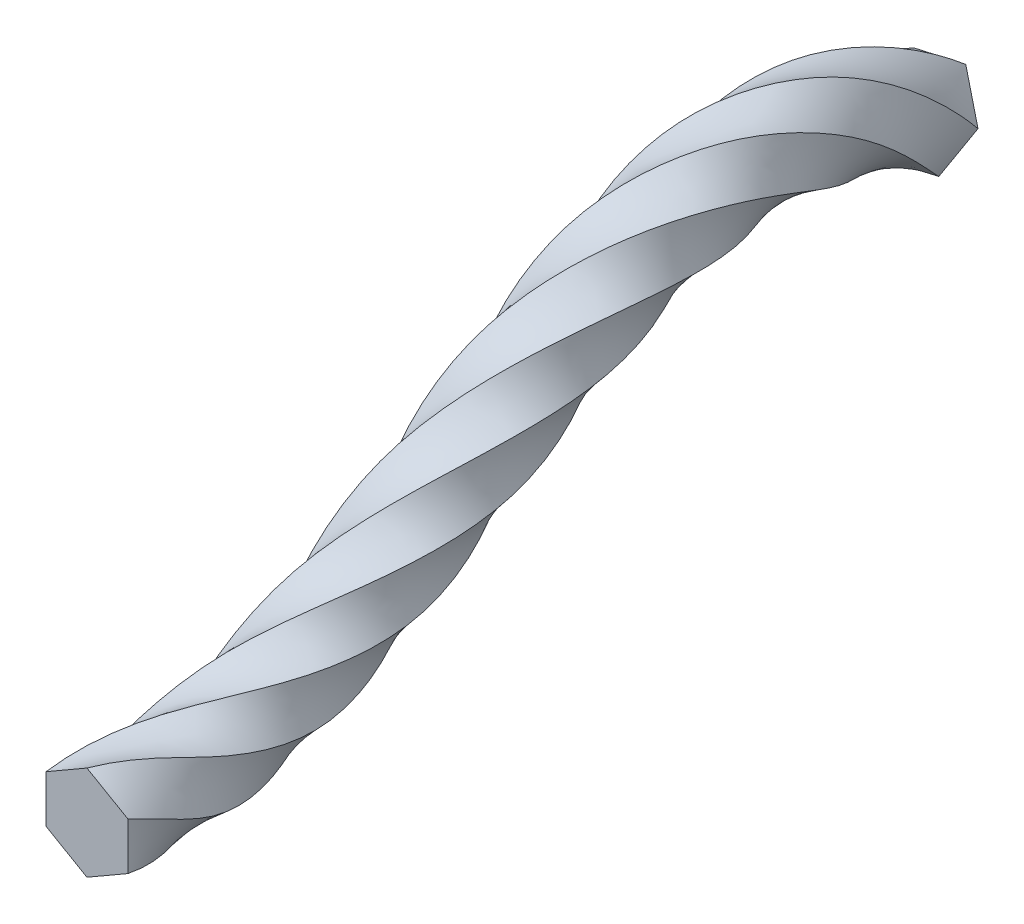
ISO-10303-21;
HEADER;
FILE_DESCRIPTION(('STEP AP214'),'2;1');
FILE_NAME('part.step','',(''),(''),'','','');
FILE_SCHEMA(('AUTOMOTIVE_DESIGN { 1 0 10303 214 1 1 1 1 }'));
ENDSEC;
DATA;
#1=APPLICATION_CONTEXT('core data for automotive mechanical design processes');
#2=APPLICATION_PROTOCOL_DEFINITION('international standard','automotive_design',2000,#1);
#3=PRODUCT_CONTEXT('',#1,'mechanical');
#4=PRODUCT('Part','Part','',(#3));
#5=PRODUCT_RELATED_PRODUCT_CATEGORY('part','',(#4));
#6=PRODUCT_DEFINITION_FORMATION('','',#4);
#7=PRODUCT_DEFINITION_CONTEXT('part definition',#1,'design');
#8=PRODUCT_DEFINITION('design','',#6,#7);
#9=PRODUCT_DEFINITION_SHAPE('','',#8);
#10=(LENGTH_UNIT() NAMED_UNIT(*) SI_UNIT(.MILLI.,.METRE.));
#11=(NAMED_UNIT(*) PLANE_ANGLE_UNIT() SI_UNIT($,.RADIAN.));
#12=(NAMED_UNIT(*) SI_UNIT($,.STERADIAN.) SOLID_ANGLE_UNIT());
#13=UNCERTAINTY_MEASURE_WITH_UNIT(LENGTH_MEASURE(1.E-05),#10,'distance_accuracy_value','');
#14=(GEOMETRIC_REPRESENTATION_CONTEXT(3) GLOBAL_UNCERTAINTY_ASSIGNED_CONTEXT((#13)) GLOBAL_UNIT_ASSIGNED_CONTEXT((#10,
#11,#12)) REPRESENTATION_CONTEXT('',''));
#15=CARTESIAN_POINT('',(0.,0.,0.));
#16=DIRECTION('',(0.,0.,1.));
#17=DIRECTION('',(1.,0.,0.));
#18=AXIS2_PLACEMENT_3D('',#15,#16,#17);
#19=CARTESIAN_POINT('',(0.,0.,0.));
#20=DIRECTION('',(0.,0.,1.));
#21=DIRECTION('',(1.,0.,0.));
#22=AXIS2_PLACEMENT_3D('',#19,#20,#21);
#23=PLANE('',#22);
#24=DIRECTION('',(0.866025403784441,-0.499999999999995,0.));
#25=VECTOR('',#24,1.);
#26=CARTESIAN_POINT('',(-0.866025403784433,-0.50000000000001,0.));
#27=LINE('',#26,#25);
#28=CARTESIAN_POINT('',(-0.866025403784433,-0.50000000000001,0.));
#29=VERTEX_POINT('',#28);
#30=CARTESIAN_POINT('',(0.,-1.,0.));
#31=VERTEX_POINT('',#30);
#32=EDGE_CURVE('E108',#29,#31,#27,.T.);
#33=ORIENTED_EDGE('',*,*,#32,.T.);
#34=DIRECTION('',(0.866025403784438,0.500000000000001,0.));
#35=VECTOR('',#34,1.);
#36=CARTESIAN_POINT('',(0.,-1.,0.));
#37=LINE('',#36,#35);
#38=CARTESIAN_POINT('',(0.86602540378444,-0.499999999999998,0.));
#39=VERTEX_POINT('',#38);
#40=EDGE_CURVE('E116',#31,#39,#37,.T.);
#41=ORIENTED_EDGE('',*,*,#40,.T.);
#42=DIRECTION('',(0.,1.,0.));
#43=VECTOR('',#42,1.);
#44=CARTESIAN_POINT('',(0.86602540378444,-0.499999999999998,0.));
#45=LINE('',#44,#43);
#46=CARTESIAN_POINT('',(0.866025403784436,0.500000000000004,0.));
#47=VERTEX_POINT('',#46);
#48=EDGE_CURVE('E137',#39,#47,#45,.T.);
#49=ORIENTED_EDGE('',*,*,#48,.T.);
#50=DIRECTION('',(-0.866025403784442,0.499999999999995,0.));
#51=VECTOR('',#50,1.);
#52=CARTESIAN_POINT('',(0.866025403784436,0.500000000000004,0.));
#53=LINE('',#52,#51);
#54=CARTESIAN_POINT('',(0.,1.,0.));
#55=VERTEX_POINT('',#54);
#56=EDGE_CURVE('E90',#47,#55,#53,.T.);
#57=ORIENTED_EDGE('',*,*,#56,.T.);
#58=DIRECTION('',(-0.866025403784434,-0.500000000000007,0.));
#59=VECTOR('',#58,1.);
#60=CARTESIAN_POINT('',(0.,1.,0.));
#61=LINE('',#60,#59);
#62=CARTESIAN_POINT('',(-0.866025403784443,0.499999999999992,0.));
#63=VERTEX_POINT('',#62);
#64=EDGE_CURVE('E85',#55,#63,#61,.T.);
#65=ORIENTED_EDGE('',*,*,#64,.T.);
#66=DIRECTION('',(0.,-1.,0.));
#67=VECTOR('',#66,1.);
#68=CARTESIAN_POINT('',(-0.866025403784443,0.499999999999992,0.));
#69=LINE('',#68,#67);
#70=EDGE_CURVE('E79',#63,#29,#69,.T.);
#71=ORIENTED_EDGE('',*,*,#70,.T.);
#72=EDGE_LOOP('',(#33,#41,#49,#57,#65,#71));
#73=FACE_BOUND('',#72,.T.);
#74=ADVANCED_FACE('F43',(#73),#23,.T.);
#75=CARTESIAN_POINT('',(0.,4.13217644037871,-17.754905888552));
#76=DIRECTION('',(0.0158548542778873,0.512418600228263,0.858589425590564));
#77=DIRECTION('',(-0.766044443118991,-0.54563630196883,0.339789548309384));
#78=AXIS2_PLACEMENT_3D('',#75,#76,#77);
#79=PLANE('',#78);
#80=DIRECTION('',(-0.984709970071781,-0.140982412648023,0.102324162176753));
#81=VECTOR('',#80,1.);
#82=CARTESIAN_POINT('',(0.342117926266106,4.9362638251947,-18.241114487928));
#83=LINE('',#82,#81);
#84=CARTESIAN_POINT('',(0.342117926266106,4.9362638251947,-18.241114487928));
#85=VERTEX_POINT('',#84);
#86=CARTESIAN_POINT('',(-0.642592043805665,4.79528141254668,-18.1387903257512));
#87=VERTEX_POINT('',#86);
#88=EDGE_CURVE('E142',#85,#87,#83,.T.);
#89=ORIENTED_EDGE('',*,*,#88,.F.);
#90=DIRECTION('',(-0.642592043805673,0.663104972167966,-0.383884437199228));
#91=VECTOR('',#90,1.);
#92=CARTESIAN_POINT('',(0.98470997007178,4.27315885302673,-17.8572300507288));
#93=LINE('',#92,#91);
#94=CARTESIAN_POINT('',(0.98470997007178,4.27315885302673,-17.8572300507288));
#95=VERTEX_POINT('',#94);
#96=EDGE_CURVE('E11',#95,#85,#93,.T.);
#97=ORIENTED_EDGE('',*,*,#96,.F.);
#98=DIRECTION('',(0.342117926266109,0.804087384815992,-0.486208599375983));
#99=VECTOR('',#98,1.);
#100=CARTESIAN_POINT('',(0.642592043805671,3.46907146821074,-17.3710214513528));
#101=LINE('',#100,#99);
#102=CARTESIAN_POINT('',(0.642592043805671,3.46907146821074,-17.3710214513528));
#103=VERTEX_POINT('',#102);
#104=EDGE_CURVE('E51',#103,#95,#101,.T.);
#105=ORIENTED_EDGE('',*,*,#104,.F.);
#106=DIRECTION('',(0.984709970071781,0.140982412648023,-0.102324162176753));
#107=VECTOR('',#106,1.);
#108=CARTESIAN_POINT('',(-0.342117926266113,3.32808905556272,-17.268697289176));
#109=LINE('',#108,#107);
#110=CARTESIAN_POINT('',(-0.342117926266113,3.32808905556272,-17.268697289176));
#111=VERTEX_POINT('',#110);
#112=EDGE_CURVE('E66',#111,#103,#109,.T.);
#113=ORIENTED_EDGE('',*,*,#112,.F.);
#114=DIRECTION('',(0.642592043805668,-0.66310497216797,0.38388443719923));
#115=VECTOR('',#114,1.);
#116=CARTESIAN_POINT('',(-0.984709970071782,3.99119402773069,-17.6525817263753));
#117=LINE('',#116,#115);
#118=CARTESIAN_POINT('',(-0.984709970071782,3.99119402773069,-17.6525817263753));
#119=VERTEX_POINT('',#118);
#120=EDGE_CURVE('E141',#119,#111,#117,.T.);
#121=ORIENTED_EDGE('',*,*,#120,.F.);
#122=DIRECTION('',(-0.342117926266116,-0.80408738481599,0.486208599375982));
#123=VECTOR('',#122,1.);
#124=CARTESIAN_POINT('',(-0.642592043805665,4.79528141254668,-18.1387903257512));
#125=LINE('',#124,#123);
#126=EDGE_CURVE('E138',#87,#119,#125,.T.);
#127=ORIENTED_EDGE('',*,*,#126,.F.);
#128=EDGE_LOOP('',(#89,#97,#105,#113,#121,#127));
#129=FACE_BOUND('',#128,.T.);
#130=ADVANCED_FACE('F190',(#129),#79,.F.);
#131=CARTESIAN_POINT('',(-0.866025403784433,-0.50000000000001,0.));
#132=CARTESIAN_POINT('',(-0.990954024169116,-0.27035031328757,-0.499358283215992));
#133=CARTESIAN_POINT('',(-1.03057462751443,-0.0438080353986598,-1.09482226872559));
#134=CARTESIAN_POINT('',(-0.899435433540427,0.580297138766811,-2.2700427295419));
#135=CARTESIAN_POINT('',(-0.652307350286108,0.989868677225888,-2.80602449434375));
#136=CARTESIAN_POINT('',(-0.0272287358214304,1.61880723067463,-3.93739442463639));
#137=CARTESIAN_POINT('',(0.340905138723877,1.84600196095368,-4.54859883017973));
#138=CARTESIAN_POINT('',(0.869875122874141,2.17126576076968,-5.97642889876077));
#139=CARTESIAN_POINT('',(1.02240392934314,2.27549387238985,-6.78593720242661));
#140=CARTESIAN_POINT('',(0.971590583019493,2.51742860090991,-8.40347345892744));
#141=CARTESIAN_POINT('',(0.769046437602985,2.65825592339455,-9.1991206035711));
#142=CARTESIAN_POINT('',(0.184912000141668,3.10511685461205,-10.5834805125516));
#143=CARTESIAN_POINT('',(-0.187504648737898,3.41566485620941,-11.1666020159137));
#144=CARTESIAN_POINT('',(-0.770844712674197,4.20501587465378,-12.2375123197817));
#145=CARTESIAN_POINT('',(-0.972606961846471,4.68976555637414,-12.7396802684801));
#146=CARTESIAN_POINT('',(-1.02176354186771,5.52846543397419,-14.000068776661));
#147=CARTESIAN_POINT('',(-0.868385885525512,5.86207849106576,-14.7786391574177));
#148=CARTESIAN_POINT('',(-0.338411639601307,5.88845278818168,-16.5120947642109));
#149=CARTESIAN_POINT('',(0.0295805250976546,5.57245880215742,-17.4324879334801));
#150=CARTESIAN_POINT('',(0.342117926266106,4.9362638251947,-18.241114487928));
#151=CARTESIAN_POINT('',(0.,-1.,0.));
#152=CARTESIAN_POINT('',(-0.247714852525142,-0.986846786883802,-0.467643193615356));
#153=CARTESIAN_POINT('',(-0.498929404031717,-0.929307175446871,-1.04665746597198));
#154=CARTESIAN_POINT('',(-0.924804470873251,-0.468536761120183,-2.41561467040401));
#155=CARTESIAN_POINT('',(-1.04254119746072,0.0428395849510625,-3.05952448566395));
#156=CARTESIAN_POINT('',(-0.925693692244143,1.11274551888365,-4.16116009177711));
#157=CARTESIAN_POINT('',(-0.692944512938061,1.66442156883953,-4.63986908099785));
#158=CARTESIAN_POINT('',(-0.0801556461195014,2.56192734571661,-5.74196810585632));
#159=CARTESIAN_POINT('',(0.290260388955425,2.91090621303586,-6.37284004060411));
#160=CARTESIAN_POINT('',(0.838674381113245,3.39095397516942,-7.82926184696237));
#161=CARTESIAN_POINT('',(1.00805967171006,3.52430751920842,-8.64802378935045));
#162=CARTESIAN_POINT('',(0.990645056793138,3.69661926288652,-10.2491161400948));
#163=CARTESIAN_POINT('',(0.804118641405957,3.73885629987428,-11.0178617517828));
#164=CARTESIAN_POINT('',(0.236798836124348,3.91694237776668,-12.3450356393474));
#165=CARTESIAN_POINT('',(-0.135084981723092,4.06456542224879,-12.8988243817672));
#166=CARTESIAN_POINT('',(-0.733569321635194,4.51188857977793,-14.0341379053472));
#167=CARTESIAN_POINT('',(-0.95077084373116,4.81369990286367,-14.6463735755892));
#168=CARTESIAN_POINT('',(-1.03318312420663,5.14396929271902,-16.2181287043766));
#169=CARTESIAN_POINT('',(-0.899014818025565,5.14564672260287,-17.1645092470143));
#170=CARTESIAN_POINT('',(-0.642592043805665,4.79528141254668,-18.1387903257512));
#171=B_SPLINE_SURFACE_WITH_KNOTS('',1,3,((#131,#132,#133,#134,#135,#136,#137,#138,#139,#140,
#141,#142,#143,#144,#145,#146,#147,#148,#149,#150),(#151,#152,#153,#154,#155,#156,#157,#158,
#159,#160,#161,#162,#163,#164,#165,#166,#167,#168,#169,#170)),.UNSPECIFIED.,.F.,.F.,.F.,(2,2),
(4,2,2,2,2,2,2,2,2,4),(0.,1.),(0.,0.0860071638298886,0.200256268351153,0.314505372872416,
0.42875447739368,0.543003581914944,0.657252686436208,0.771501790957472,0.885750895478736,1.),.UNSPECIFIED.);
#172=CARTESIAN_POINT('',(0.,-1.,0.));
#173=CARTESIAN_POINT('',(-0.247714852525142,-0.986846786883802,-0.467643193615356));
#174=CARTESIAN_POINT('',(-0.498929404031717,-0.929307175446871,-1.04665746597198));
#175=CARTESIAN_POINT('',(-0.924804470873251,-0.468536761120183,-2.41561467040401));
#176=CARTESIAN_POINT('',(-1.04254119746072,0.0428395849510625,-3.05952448566395));
#177=CARTESIAN_POINT('',(-0.925693692244143,1.11274551888365,-4.16116009177711));
#178=CARTESIAN_POINT('',(-0.692944512938061,1.66442156883953,-4.63986908099785));
#179=CARTESIAN_POINT('',(-0.0801556461195014,2.56192734571661,-5.74196810585632));
#180=CARTESIAN_POINT('',(0.290260388955425,2.91090621303586,-6.37284004060411));
#181=CARTESIAN_POINT('',(0.838674381113245,3.39095397516942,-7.82926184696237));
#182=CARTESIAN_POINT('',(1.00805967171006,3.52430751920842,-8.64802378935045));
#183=CARTESIAN_POINT('',(0.990645056793138,3.69661926288652,-10.2491161400948));
#184=CARTESIAN_POINT('',(0.804118641405957,3.73885629987428,-11.0178617517828));
#185=CARTESIAN_POINT('',(0.236798836124348,3.91694237776668,-12.3450356393474));
#186=CARTESIAN_POINT('',(-0.135084981723092,4.06456542224879,-12.8988243817672));
#187=CARTESIAN_POINT('',(-0.733569321635194,4.51188857977793,-14.0341379053472));
#188=CARTESIAN_POINT('',(-0.95077084373116,4.81369990286367,-14.6463735755892));
#189=CARTESIAN_POINT('',(-1.03318312420663,5.14396929271902,-16.2181287043766));
#190=CARTESIAN_POINT('',(-0.899014818025565,5.14564672260287,-17.1645092470143));
#191=CARTESIAN_POINT('',(-0.642592043805665,4.79528141254668,-18.1387903257512));
#192=B_SPLINE_CURVE_WITH_KNOTS('',3,(#172,#173,#174,#175,#176,#177,#178,#179,#180,#181,#182,
#183,#184,#185,#186,#187,#188,#189,#190,#191),.UNSPECIFIED.,.F.,.F.,(4,2,2,2,2,2,2,2,2,4),(0.,
0.0860071638298886,0.200256268351153,0.314505372872416,0.42875447739368,0.543003581914944,
0.657252686436208,0.771501790957472,0.885750895478736,1.),.UNSPECIFIED.);
#193=EDGE_CURVE('E112',#31,#87,#192,.T.);
#194=CARTESIAN_POINT('',(-0.866025403784433,-0.50000000000001,0.));
#195=CARTESIAN_POINT('',(-0.990954024169116,-0.27035031328757,-0.499358283215992));
#196=CARTESIAN_POINT('',(-1.03057462751443,-0.0438080353986598,-1.09482226872559));
#197=CARTESIAN_POINT('',(-0.899435433540427,0.580297138766811,-2.2700427295419));
#198=CARTESIAN_POINT('',(-0.652307350286108,0.989868677225888,-2.80602449434375));
#199=CARTESIAN_POINT('',(-0.0272287358214304,1.61880723067463,-3.93739442463639));
#200=CARTESIAN_POINT('',(0.340905138723877,1.84600196095368,-4.54859883017973));
#201=CARTESIAN_POINT('',(0.869875122874141,2.17126576076968,-5.97642889876077));
#202=CARTESIAN_POINT('',(1.02240392934314,2.27549387238985,-6.78593720242661));
#203=CARTESIAN_POINT('',(0.971590583019493,2.51742860090991,-8.40347345892744));
#204=CARTESIAN_POINT('',(0.769046437602985,2.65825592339455,-9.1991206035711));
#205=CARTESIAN_POINT('',(0.184912000141668,3.10511685461205,-10.5834805125516));
#206=CARTESIAN_POINT('',(-0.187504648737898,3.41566485620941,-11.1666020159137));
#207=CARTESIAN_POINT('',(-0.770844712674197,4.20501587465378,-12.2375123197817));
#208=CARTESIAN_POINT('',(-0.972606961846471,4.68976555637414,-12.7396802684801));
#209=CARTESIAN_POINT('',(-1.02176354186771,5.52846543397419,-14.000068776661));
#210=CARTESIAN_POINT('',(-0.868385885525512,5.86207849106576,-14.7786391574177));
#211=CARTESIAN_POINT('',(-0.338411639601307,5.88845278818168,-16.5120947642109));
#212=CARTESIAN_POINT('',(0.0295805250976546,5.57245880215742,-17.4324879334801));
#213=CARTESIAN_POINT('',(0.342117926266106,4.9362638251947,-18.241114487928));
#214=B_SPLINE_CURVE_WITH_KNOTS('',3,(#194,#195,#196,#197,#198,#199,#200,#201,#202,#203,#204,
#205,#206,#207,#208,#209,#210,#211,#212,#213),.UNSPECIFIED.,.F.,.F.,(4,2,2,2,2,2,2,2,2,4),(0.,
0.0860071638298886,0.200256268351153,0.314505372872416,0.42875447739368,0.543003581914944,
0.657252686436208,0.771501790957472,0.885750895478736,1.),.UNSPECIFIED.);
#215=EDGE_CURVE('E110',#29,#85,#214,.T.);
#216=ORIENTED_EDGE('',*,*,#193,.F.);
#217=ORIENTED_EDGE('',*,*,#32,.F.);
#218=ORIENTED_EDGE('',*,*,#215,.T.);
#219=ORIENTED_EDGE('',*,*,#88,.T.);
#220=EDGE_LOOP('',(#216,#217,#218,#219));
#221=FACE_BOUND('',#220,.T.);
#222=ADVANCED_FACE('F109',(#221),#171,.F.);
#223=CARTESIAN_POINT('',(0.,-1.,0.));
#224=CARTESIAN_POINT('',(-0.247714852525142,-0.986846786883802,-0.467643193615356));
#225=CARTESIAN_POINT('',(-0.498929404031717,-0.929307175446903,-1.04665746597198));
#226=CARTESIAN_POINT('',(-0.924804470873251,-0.468536761120141,-2.41561467040401));
#227=CARTESIAN_POINT('',(-1.04254119746072,0.0428395849510623,-3.05952448566395));
#228=CARTESIAN_POINT('',(-0.925693692244143,1.11274551888365,-4.16116009177711));
#229=CARTESIAN_POINT('',(-0.692944512938061,1.66442156883953,-4.63986908099785));
#230=CARTESIAN_POINT('',(-0.0801556461195015,2.56192734571661,-5.74196810585632));
#231=CARTESIAN_POINT('',(0.290260388955425,2.91090621303586,-6.37284004060411));
#232=CARTESIAN_POINT('',(0.838674381113245,3.39095397516942,-7.82926184696237));
#233=CARTESIAN_POINT('',(1.00805967171006,3.52430751920842,-8.64802378935045));
#234=CARTESIAN_POINT('',(0.990645056793138,3.69661926288652,-10.2491161400948));
#235=CARTESIAN_POINT('',(0.804118641405957,3.73885629987428,-11.0178617517828));
#236=CARTESIAN_POINT('',(0.236798836124348,3.91694237776668,-12.3450356393474));
#237=CARTESIAN_POINT('',(-0.135084981723092,4.06456542224879,-12.8988243817672));
#238=CARTESIAN_POINT('',(-0.733569321635194,4.51188857977793,-14.0341379053472));
#239=CARTESIAN_POINT('',(-0.95077084373116,4.81369990286367,-14.6463735755892));
#240=CARTESIAN_POINT('',(-1.03318312420663,5.14396929271902,-16.2181287043766));
#241=CARTESIAN_POINT('',(-0.899014818025565,5.14564672260287,-17.1645092470143));
#242=CARTESIAN_POINT('',(-0.642592043805665,4.79528141254668,-18.1387903257512));
#243=CARTESIAN_POINT('',(0.86602540378444,-0.499999999999998,0.));
#244=CARTESIAN_POINT('',(0.742157347230914,-0.701391433385672,-0.505706085762784));
#245=CARTESIAN_POINT('',(0.531645223482725,-0.912053752424213,-1.03937925902984));
#246=CARTESIAN_POINT('',(-0.0253690373328454,-1.01355962098081,-2.47992456630241));
#247=CARTESIAN_POINT('',(-0.390233847174497,-0.759332229093102,-3.27480580644593));
#248=CARTESIAN_POINT('',(-0.898464956422849,0.145750073741609,-4.58484505860446));
#249=CARTESIAN_POINT('',(-1.03384965166188,0.781923735425361,-5.10517002828337));
#250=CARTESIAN_POINT('',(-0.950030768993718,2.06179324474153,-6.06555250647102));
#251=CARTESIAN_POINT('',(-0.732143540387669,2.70247920359291,-6.52020927095212));
#252=CARTESIAN_POINT('',(-0.132916201906294,3.74167860527362,-7.62075938651919));
#253=CARTESIAN_POINT('',(0.239013234107129,4.13935600432899,-8.27224561412549));
#254=CARTESIAN_POINT('',(0.805733056651434,4.60929824645586,-9.75540476364812));
#255=CARTESIAN_POINT('',(0.991623290143908,4.68032754693333,-10.5790841473581));
#256=CARTESIAN_POINT('',(1.00764354879851,4.60690532348675,-12.1357476791011));
#257=CARTESIAN_POINT('',(0.837521980123382,4.46828115196419,-12.8497131428251));
#258=CARTESIAN_POINT('',(0.288194220232519,4.25804466261417,-14.0882224447345));
#259=CARTESIAN_POINT('',(-0.0823849582056997,4.2088807075131,-14.6231273480271));
#260=CARTESIAN_POINT('',(-0.694771484605287,4.1871597713933,-15.9174065930539));
#261=CARTESIAN_POINT('',(-0.926405339817353,4.19649152521276,-16.6955540485421));
#262=CARTESIAN_POINT('',(-0.984709970071782,3.99119402773069,-17.6525817263753));
#263=B_SPLINE_SURFACE_WITH_KNOTS('',1,3,((#223,#224,#225,#226,#227,#228,#229,#230,#231,#232,
#233,#234,#235,#236,#237,#238,#239,#240,#241,#242),(#243,#244,#245,#246,#247,#248,#249,#250,
#251,#252,#253,#254,#255,#256,#257,#258,#259,#260,#261,#262)),.UNSPECIFIED.,.F.,.F.,.F.,(2,2),
(4,2,2,2,2,2,2,2,2,4),(0.,1.),(0.,0.0860071638298886,0.200256268351153,0.314505372872416,
0.42875447739368,0.543003581914944,0.657252686436208,0.771501790957472,0.885750895478736,1.),.UNSPECIFIED.);
#264=CARTESIAN_POINT('',(0.86602540378444,-0.499999999999998,0.));
#265=CARTESIAN_POINT('',(0.742157347230914,-0.701391433385672,-0.505706085762784));
#266=CARTESIAN_POINT('',(0.531645223482725,-0.912053752424213,-1.03937925902984));
#267=CARTESIAN_POINT('',(-0.0253690373328454,-1.01355962098081,-2.47992456630241));
#268=CARTESIAN_POINT('',(-0.390233847174497,-0.759332229093102,-3.27480580644593));
#269=CARTESIAN_POINT('',(-0.898464956422849,0.145750073741609,-4.58484505860446));
#270=CARTESIAN_POINT('',(-1.03384965166188,0.781923735425361,-5.10517002828337));
#271=CARTESIAN_POINT('',(-0.950030768993718,2.06179324474153,-6.06555250647102));
#272=CARTESIAN_POINT('',(-0.732143540387669,2.70247920359291,-6.52020927095212));
#273=CARTESIAN_POINT('',(-0.132916201906294,3.74167860527362,-7.62075938651919));
#274=CARTESIAN_POINT('',(0.239013234107129,4.13935600432899,-8.27224561412549));
#275=CARTESIAN_POINT('',(0.805733056651434,4.60929824645586,-9.75540476364812));
#276=CARTESIAN_POINT('',(0.991623290143908,4.68032754693333,-10.5790841473581));
#277=CARTESIAN_POINT('',(1.00764354879851,4.60690532348675,-12.1357476791011));
#278=CARTESIAN_POINT('',(0.837521980123382,4.46828115196419,-12.8497131428251));
#279=CARTESIAN_POINT('',(0.288194220232519,4.25804466261417,-14.0882224447345));
#280=CARTESIAN_POINT('',(-0.0823849582056997,4.2088807075131,-14.6231273480271));
#281=CARTESIAN_POINT('',(-0.694771484605287,4.1871597713933,-15.9174065930539));
#282=CARTESIAN_POINT('',(-0.926405339817353,4.19649152521276,-16.6955540485421));
#283=CARTESIAN_POINT('',(-0.984709970071782,3.99119402773069,-17.6525817263753));
#284=B_SPLINE_CURVE_WITH_KNOTS('',3,(#264,#265,#266,#267,#268,#269,#270,#271,#272,#273,#274,
#275,#276,#277,#278,#279,#280,#281,#282,#283),.UNSPECIFIED.,.F.,.F.,(4,2,2,2,2,2,2,2,2,4),(0.,
0.0860071638298886,0.200256268351153,0.314505372872416,0.42875447739368,0.543003581914944,
0.657252686436208,0.771501790957472,0.885750895478736,1.),.UNSPECIFIED.);
#285=EDGE_CURVE('E124',#39,#119,#284,.T.);
#286=ORIENTED_EDGE('',*,*,#285,.F.);
#287=ORIENTED_EDGE('',*,*,#40,.F.);
#288=ORIENTED_EDGE('',*,*,#193,.T.);
#289=ORIENTED_EDGE('',*,*,#126,.T.);
#290=EDGE_LOOP('',(#286,#287,#288,#289));
#291=FACE_BOUND('',#290,.T.);
#292=ADVANCED_FACE('F193',(#291),#263,.F.);
#293=CARTESIAN_POINT('',(0.86602540378444,-0.499999999999998,0.));
#294=CARTESIAN_POINT('',(0.742157347230915,-0.70139143338567,-0.50570608576278));
#295=CARTESIAN_POINT('',(0.531645223482693,-0.912053752424212,-1.03937925902984));
#296=CARTESIAN_POINT('',(-0.0253690373328028,-1.01355962098081,-2.47992456630241));
#297=CARTESIAN_POINT('',(-0.390233847174497,-0.759332229093101,-3.2748058064456));
#298=CARTESIAN_POINT('',(-0.898464956422849,0.145750073741609,-4.5848450586048));
#299=CARTESIAN_POINT('',(-1.03384965166188,0.781923735425361,-5.10517002828337));
#300=CARTESIAN_POINT('',(-0.950030768993717,2.06179324474153,-6.06555250647102));
#301=CARTESIAN_POINT('',(-0.732143540387669,2.70247920359291,-6.52020927095212));
#302=CARTESIAN_POINT('',(-0.132916201906294,3.74167860527362,-7.62075938651919));
#303=CARTESIAN_POINT('',(0.239013234107129,4.13935600432864,-8.27224561412549));
#304=CARTESIAN_POINT('',(0.805733056651434,4.60929824645621,-9.75540476364812));
#305=CARTESIAN_POINT('',(0.991623290143907,4.68032754693367,-10.5790841473581));
#306=CARTESIAN_POINT('',(1.00764354879851,4.60690532348641,-12.1357476791011));
#307=CARTESIAN_POINT('',(0.837521980123382,4.46828115196419,-12.8497131428251));
#308=CARTESIAN_POINT('',(0.288194220232519,4.25804466261417,-14.0882224447345));
#309=CARTESIAN_POINT('',(-0.0823849582057218,4.20888070751345,-14.6231273480271));
#310=CARTESIAN_POINT('',(-0.694771484605265,4.18715977139294,-15.9174065930539));
#311=CARTESIAN_POINT('',(-0.926405339817802,4.19649152521443,-16.6955540485424));
#312=CARTESIAN_POINT('',(-0.984709970071782,3.99119402773069,-17.6525817263753));
#313=CARTESIAN_POINT('',(0.866025403784436,0.500000000000004,0.));
#314=CARTESIAN_POINT('',(0.991303277334129,0.296316400022004,-0.57766533153255));
#315=CARTESIAN_POINT('',(1.03057462751439,-0.00930118935328113,-1.08026585484124));
#316=CARTESIAN_POINT('',(0.899435433540468,-0.509748580954493,-2.39866252133878));
#317=CARTESIAN_POINT('',(0.652307350286271,-0.614474950862432,-3.23658713590722));
#318=CARTESIAN_POINT('',(0.0272287358212543,-0.315183659609444,-4.78476435829161));
#319=CARTESIAN_POINT('',(-0.340905138723839,0.0810062941255554,-5.47920072475113));
#320=CARTESIAN_POINT('',(-0.86987512287419,1.17099755881931,-6.62359769998983));
#321=CARTESIAN_POINT('',(-1.02240392934314,1.8586398535041,-7.08067566312263));
#322=CARTESIAN_POINT('',(-0.971590583019493,3.21887786111811,-7.98646853804107));
#323=CARTESIAN_POINT('',(-0.769046437602826,3.88835289363533,-8.44756425312049));
#324=CARTESIAN_POINT('',(-0.184912000141815,4.93047482175108,-9.59605775965895));
#325=CARTESIAN_POINT('',(0.187504648738094,5.29860735032802,-10.2890468070637));
#326=CARTESIAN_POINT('',(0.770844712674013,5.58494176609341,-11.8189363992899));
#327=CARTESIAN_POINT('',(0.972606961846472,5.49719701580564,-12.6414577905965));
#328=CARTESIAN_POINT('',(1.02176354186771,5.02077759964601,-14.1082378554351));
#329=CARTESIAN_POINT('',(0.868385885525462,4.65244010036534,-14.7321467022935));
#330=CARTESIAN_POINT('',(0.338411639601345,3.97483374552954,-15.9106505415655));
#331=CARTESIAN_POINT('',(-0.0293159248593732,3.675499126814,-16.4976640369609));
#332=CARTESIAN_POINT('',(-0.342117926266113,3.32808905556272,-17.268697289176));
#333=B_SPLINE_SURFACE_WITH_KNOTS('',1,3,((#293,#294,#295,#296,#297,#298,#299,#300,#301,#302,
#303,#304,#305,#306,#307,#308,#309,#310,#311,#312),(#313,#314,#315,#316,#317,#318,#319,#320,
#321,#322,#323,#324,#325,#326,#327,#328,#329,#330,#331,#332)),.UNSPECIFIED.,.F.,.F.,.F.,(2,2),
(4,2,2,2,2,2,2,2,2,4),(0.,1.),(0.,0.0860071638298886,0.200256268351153,0.314505372872416,
0.42875447739368,0.543003581914944,0.657252686436208,0.771501790957472,0.885750895478736,1.),.UNSPECIFIED.);
#334=CARTESIAN_POINT('',(0.866025403784436,0.500000000000004,0.));
#335=CARTESIAN_POINT('',(0.991303277334129,0.296316400022004,-0.57766533153255));
#336=CARTESIAN_POINT('',(1.03057462751439,-0.00930118935328113,-1.08026585484124));
#337=CARTESIAN_POINT('',(0.899435433540468,-0.509748580954493,-2.39866252133878));
#338=CARTESIAN_POINT('',(0.652307350286271,-0.614474950862432,-3.23658713590722));
#339=CARTESIAN_POINT('',(0.0272287358212543,-0.315183659609444,-4.78476435829161));
#340=CARTESIAN_POINT('',(-0.340905138723839,0.0810062941255554,-5.47920072475113));
#341=CARTESIAN_POINT('',(-0.86987512287419,1.17099755881931,-6.62359769998983));
#342=CARTESIAN_POINT('',(-1.02240392934314,1.8586398535041,-7.08067566312263));
#343=CARTESIAN_POINT('',(-0.971590583019493,3.21887786111811,-7.98646853804107));
#344=CARTESIAN_POINT('',(-0.769046437602826,3.88835289363533,-8.44756425312049));
#345=CARTESIAN_POINT('',(-0.184912000141815,4.93047482175108,-9.59605775965895));
#346=CARTESIAN_POINT('',(0.187504648738094,5.29860735032802,-10.2890468070637));
#347=CARTESIAN_POINT('',(0.770844712674013,5.58494176609341,-11.8189363992899));
#348=CARTESIAN_POINT('',(0.972606961846472,5.49719701580564,-12.6414577905965));
#349=CARTESIAN_POINT('',(1.02176354186771,5.02077759964601,-14.1082378554351));
#350=CARTESIAN_POINT('',(0.868385885525462,4.65244010036534,-14.7321467022935));
#351=CARTESIAN_POINT('',(0.338411639601345,3.97483374552954,-15.9106505415655));
#352=CARTESIAN_POINT('',(-0.0293159248593732,3.675499126814,-16.4976640369609));
#353=CARTESIAN_POINT('',(-0.342117926266113,3.32808905556272,-17.268697289176));
#354=B_SPLINE_CURVE_WITH_KNOTS('',3,(#334,#335,#336,#337,#338,#339,#340,#341,#342,#343,#344,
#345,#346,#347,#348,#349,#350,#351,#352,#353),.UNSPECIFIED.,.F.,.F.,(4,2,2,2,2,2,2,2,2,4),(0.,
0.0860071638298886,0.200256268351153,0.314505372872416,0.42875447739368,0.543003581914944,
0.657252686436208,0.771501790957472,0.885750895478736,1.),.UNSPECIFIED.);
#355=EDGE_CURVE('E148',#47,#111,#354,.T.);
#356=ORIENTED_EDGE('',*,*,#355,.F.);
#357=ORIENTED_EDGE('',*,*,#48,.F.);
#358=ORIENTED_EDGE('',*,*,#285,.T.);
#359=ORIENTED_EDGE('',*,*,#120,.T.);
#360=EDGE_LOOP('',(#356,#357,#358,#359));
#361=FACE_BOUND('',#360,.T.);
#362=ADVANCED_FACE('F196',(#361),#333,.F.);
#363=CARTESIAN_POINT('',(0.866025403784436,0.500000000000004,0.));
#364=CARTESIAN_POINT('',(0.99130327733413,0.296316400022002,-0.577665331532554));
#365=CARTESIAN_POINT('',(1.03057462751439,-0.00930118935326497,-1.08026585484124));
#366=CARTESIAN_POINT('',(0.899435433540468,-0.509748580954515,-2.39866252133878));
#367=CARTESIAN_POINT('',(0.652307350286271,-0.614474950862432,-3.23658713590722));
#368=CARTESIAN_POINT('',(0.0272287358212544,-0.315183659609444,-4.78476435829161));
#369=CARTESIAN_POINT('',(-0.340905138723839,0.0810062941255991,-5.47920072475113));
#370=CARTESIAN_POINT('',(-0.86987512287419,1.17099755881927,-6.62359769998983));
#371=CARTESIAN_POINT('',(-1.02240392934314,1.8586398535041,-7.08067566312263));
#372=CARTESIAN_POINT('',(-0.971590583019493,3.21887786111811,-7.98646853804107));
#373=CARTESIAN_POINT('',(-0.769046437602826,3.88835289363533,-8.44756425312049));
#374=CARTESIAN_POINT('',(-0.184912000141815,4.93047482175108,-9.59605775965895));
#375=CARTESIAN_POINT('',(0.187504648738115,5.29860735032802,-10.2890468070637));
#376=CARTESIAN_POINT('',(0.770844712673992,5.58494176609341,-11.8189363992899));
#377=CARTESIAN_POINT('',(0.972606961846473,5.49719701580564,-12.6414577905965));
#378=CARTESIAN_POINT('',(1.02176354186771,5.02077759964601,-14.1082378554351));
#379=CARTESIAN_POINT('',(0.868385885525506,4.65244010036534,-14.7321467022935));
#380=CARTESIAN_POINT('',(0.338411639601301,3.97483374552954,-15.9106505415655));
#381=CARTESIAN_POINT('',(-0.0293159248594412,3.67549912681401,-16.4976640369608));
#382=CARTESIAN_POINT('',(-0.342117926266113,3.32808905556272,-17.268697289176));
#383=CARTESIAN_POINT('',(0.,1.,0.));
#384=CARTESIAN_POINT('',(0.252351627490881,1.01339939876355,-0.609752669095735));
#385=CARTESIAN_POINT('',(0.498929404031711,0.876197950694974,-1.12843065759492));
#386=CARTESIAN_POINT('',(0.924804470873246,0.53908531893247,-2.25309058047658));
#387=CARTESIAN_POINT('',(1.04254119746089,0.332554141412403,-2.98308714458685));
#388=CARTESIAN_POINT('',(0.925693692243975,0.190878052181543,-4.56099869115106));
#389=CARTESIAN_POINT('',(0.692944512938067,0.26258668623979,-5.38793047393371));
#390=CARTESIAN_POINT('',(0.0801556461195084,0.7803359738723,-6.85805849289359));
#391=CARTESIAN_POINT('',(-0.29026038895542,1.22322751285825,-7.49377282494549));
#392=CARTESIAN_POINT('',(-0.83867438111324,2.34535248685841,-8.56068015000579));
#393=CARTESIAN_POINT('',(-1.00805967170989,3.02230129782128,-8.99866106734045));
#394=CARTESIAN_POINT('',(-0.990645056793313,4.33897241347678,-9.93042213211646));
#395=CARTESIAN_POINT('',(-0.804118641405711,4.97541590666348,-10.437787071194));
#396=CARTESIAN_POINT('',(-0.236798836124608,5.87301526298017,-11.7114130797249));
#397=CARTESIAN_POINT('',(0.135084981723087,6.12239714993101,-12.4823136773086));
#398=CARTESIAN_POINT('',(0.733569321635188,6.03735445384228,-14.0741687267497));
#399=CARTESIAN_POINT('',(0.950770843731159,5.70081868856744,-14.8644122841219));
#400=CARTESIAN_POINT('',(1.03318312420663,4.71931724099221,-16.2046166013999));
#401=CARTESIAN_POINT('',(0.89518748508438,4.09898059235076,-16.7650269424858));
#402=CARTESIAN_POINT('',(0.642592043805671,3.46907146821074,-17.3710214513528));
#403=B_SPLINE_SURFACE_WITH_KNOTS('',1,3,((#363,#364,#365,#366,#367,#368,#369,#370,#371,#372,
#373,#374,#375,#376,#377,#378,#379,#380,#381,#382),(#383,#384,#385,#386,#387,#388,#389,#390,
#391,#392,#393,#394,#395,#396,#397,#398,#399,#400,#401,#402)),.UNSPECIFIED.,.F.,.F.,.F.,(2,2),
(4,2,2,2,2,2,2,2,2,4),(0.,1.),(0.,0.0860071638298886,0.200256268351153,0.314505372872416,
0.42875447739368,0.543003581914944,0.657252686436208,0.771501790957472,0.885750895478736,1.),.UNSPECIFIED.);
#404=CARTESIAN_POINT('',(0.,1.,0.));
#405=CARTESIAN_POINT('',(0.252351627490881,1.01339939876355,-0.609752669095735));
#406=CARTESIAN_POINT('',(0.498929404031711,0.876197950694974,-1.12843065759492));
#407=CARTESIAN_POINT('',(0.924804470873246,0.53908531893247,-2.25309058047658));
#408=CARTESIAN_POINT('',(1.04254119746089,0.332554141412403,-2.98308714458685));
#409=CARTESIAN_POINT('',(0.925693692243975,0.190878052181543,-4.56099869115106));
#410=CARTESIAN_POINT('',(0.692944512938067,0.26258668623979,-5.38793047393371));
#411=CARTESIAN_POINT('',(0.0801556461195084,0.7803359738723,-6.85805849289359));
#412=CARTESIAN_POINT('',(-0.29026038895542,1.22322751285825,-7.49377282494549));
#413=CARTESIAN_POINT('',(-0.83867438111324,2.34535248685841,-8.56068015000579));
#414=CARTESIAN_POINT('',(-1.00805967170989,3.02230129782128,-8.99866106734045));
#415=CARTESIAN_POINT('',(-0.990645056793313,4.33897241347678,-9.93042213211646));
#416=CARTESIAN_POINT('',(-0.804118641405711,4.97541590666348,-10.437787071194));
#417=CARTESIAN_POINT('',(-0.236798836124608,5.87301526298017,-11.7114130797249));
#418=CARTESIAN_POINT('',(0.135084981723087,6.12239714993101,-12.4823136773086));
#419=CARTESIAN_POINT('',(0.733569321635188,6.03735445384228,-14.0741687267497));
#420=CARTESIAN_POINT('',(0.950770843731159,5.70081868856744,-14.8644122841219));
#421=CARTESIAN_POINT('',(1.03318312420663,4.71931724099221,-16.2046166013999));
#422=CARTESIAN_POINT('',(0.89518748508438,4.09898059235076,-16.7650269424858));
#423=CARTESIAN_POINT('',(0.642592043805671,3.46907146821074,-17.3710214513528));
#424=B_SPLINE_CURVE_WITH_KNOTS('',3,(#404,#405,#406,#407,#408,#409,#410,#411,#412,#413,#414,
#415,#416,#417,#418,#419,#420,#421,#422,#423),.UNSPECIFIED.,.F.,.F.,(4,2,2,2,2,2,2,2,2,4),(0.,
0.0860071638298886,0.200256268351153,0.314505372872416,0.42875447739368,0.543003581914944,
0.657252686436208,0.771501790957472,0.885750895478736,1.),.UNSPECIFIED.);
#425=EDGE_CURVE('E160',#55,#103,#424,.T.);
#426=ORIENTED_EDGE('',*,*,#425,.F.);
#427=ORIENTED_EDGE('',*,*,#56,.F.);
#428=ORIENTED_EDGE('',*,*,#355,.T.);
#429=ORIENTED_EDGE('',*,*,#112,.T.);
#430=EDGE_LOOP('',(#426,#427,#428,#429));
#431=FACE_BOUND('',#430,.T.);
#432=ADVANCED_FACE('F197',(#431),#403,.F.);
#433=CARTESIAN_POINT('',(0.,1.,0.));
#434=CARTESIAN_POINT('',(0.252351627490877,1.01339939876355,-0.609752669095727));
#435=CARTESIAN_POINT('',(0.498929404031743,0.876197950694941,-1.12843065759492));
#436=CARTESIAN_POINT('',(0.924804470873203,0.539085318932512,-2.25309058047658));
#437=CARTESIAN_POINT('',(1.04254119746089,0.332554141412403,-2.98308714458668));
#438=CARTESIAN_POINT('',(0.925693692243975,0.190878052181543,-4.56099869115123));
#439=CARTESIAN_POINT('',(0.692944512938067,0.262586686239746,-5.38793047393371));
#440=CARTESIAN_POINT('',(0.0801556461195081,0.780335973872344,-6.85805849289359));
#441=CARTESIAN_POINT('',(-0.290260388955464,1.22322751285834,-7.49377282494549));
#442=CARTESIAN_POINT('',(-0.838674381113195,2.34535248685832,-8.56068015000579));
#443=CARTESIAN_POINT('',(-1.00805967170989,3.02230129782145,-8.99866106734045));
#444=CARTESIAN_POINT('',(-0.990645056793313,4.33897241347661,-9.93042213211646));
#445=CARTESIAN_POINT('',(-0.804118641405711,4.97541590666314,-10.437787071194));
#446=CARTESIAN_POINT('',(-0.236798836124608,5.8730152629805,-11.7114130797249));
#447=CARTESIAN_POINT('',(0.135084981723087,6.12239714993101,-12.4823136773086));
#448=CARTESIAN_POINT('',(0.733569321635188,6.03735445384228,-14.0741687267497));
#449=CARTESIAN_POINT('',(0.950770843731159,5.70081868856744,-14.8644122841219));
#450=CARTESIAN_POINT('',(1.03318312420663,4.71931724099221,-16.2046166013999));
#451=CARTESIAN_POINT('',(0.895187485084305,4.09898059235107,-16.7650269424861));
#452=CARTESIAN_POINT('',(0.642592043805671,3.46907146821074,-17.3710214513528));
#453=CARTESIAN_POINT('',(-0.866025403784443,0.499999999999992,0.));
#454=CARTESIAN_POINT('',(-0.740153221869901,0.731384176679641,-0.56964740322271));
#455=CARTESIAN_POINT('',(-0.531645223482683,0.858944527672244,-1.13570886453699));
#456=CARTESIAN_POINT('',(0.025369037332775,1.08410817879317,-2.18878068457826));
#457=CARTESIAN_POINT('',(0.390233847174662,1.13472595545656,-2.7678058238052));
#458=CARTESIAN_POINT('',(0.898464956422675,1.15787349732358,-4.13731372432337));
#459=CARTESIAN_POINT('',(1.03384965166188,1.14508451965383,-4.92262952664784));
#460=CARTESIAN_POINT('',(0.950030768993718,1.28047007484751,-6.53447409227923));
#461=CARTESIAN_POINT('',(0.73214354038763,1.43165452230113,-7.34640359459713));
#462=CARTESIAN_POINT('',(0.132916201906344,1.99462785675431,-8.76918261044933));
#463=CARTESIAN_POINT('',(-0.239013234106948,2.40725281270089,-9.37443924256541));
#464=CARTESIAN_POINT('',(-0.805733056651604,3.42629342990727,-10.4241335085631));
#465=CARTESIAN_POINT('',(-0.991623290143739,4.03394465960425,-10.8765646756193));
#466=CARTESIAN_POINT('',(-1.00764354879868,5.18305231726027,-11.9207010399704));
#467=CARTESIAN_POINT('',(-0.837521980123428,5.71868142021526,-12.5314249162508));
#468=CARTESIAN_POINT('',(-0.288194220232483,6.29119837100636,-14.0200841873623));
#469=CARTESIAN_POINT('',(0.082384958205649,6.30563788391766,-14.887658511684));
#470=CARTESIAN_POINT('',(0.694771484605325,5.67612676231828,-16.5053387127226));
#471=CARTESIAN_POINT('',(0.927307999470985,5.04757099239483,-17.2313208664904));
#472=CARTESIAN_POINT('',(0.98470997007178,4.27315885302673,-17.8572300507288));
#473=B_SPLINE_SURFACE_WITH_KNOTS('',1,3,((#433,#434,#435,#436,#437,#438,#439,#440,#441,#442,
#443,#444,#445,#446,#447,#448,#449,#450,#451,#452),(#453,#454,#455,#456,#457,#458,#459,#460,
#461,#462,#463,#464,#465,#466,#467,#468,#469,#470,#471,#472)),.UNSPECIFIED.,.F.,.F.,.F.,(2,2),
(4,2,2,2,2,2,2,2,2,4),(0.,1.),(0.,0.0860071638298886,0.200256268351153,0.314505372872416,
0.42875447739368,0.543003581914944,0.657252686436208,0.771501790957472,0.885750895478736,1.),.UNSPECIFIED.);
#474=CARTESIAN_POINT('',(-0.866025403784443,0.499999999999992,0.));
#475=CARTESIAN_POINT('',(-0.740153221869901,0.731384176679641,-0.56964740322271));
#476=CARTESIAN_POINT('',(-0.531645223482683,0.858944527672244,-1.13570886453699));
#477=CARTESIAN_POINT('',(0.025369037332775,1.08410817879317,-2.18878068457826));
#478=CARTESIAN_POINT('',(0.390233847174662,1.13472595545656,-2.7678058238052));
#479=CARTESIAN_POINT('',(0.898464956422675,1.15787349732358,-4.13731372432337));
#480=CARTESIAN_POINT('',(1.03384965166188,1.14508451965383,-4.92262952664784));
#481=CARTESIAN_POINT('',(0.950030768993718,1.28047007484751,-6.53447409227923));
#482=CARTESIAN_POINT('',(0.73214354038763,1.43165452230113,-7.34640359459713));
#483=CARTESIAN_POINT('',(0.132916201906344,1.99462785675431,-8.76918261044933));
#484=CARTESIAN_POINT('',(-0.239013234106948,2.40725281270089,-9.37443924256541));
#485=CARTESIAN_POINT('',(-0.805733056651604,3.42629342990727,-10.4241335085631));
#486=CARTESIAN_POINT('',(-0.991623290143739,4.03394465960425,-10.8765646756193));
#487=CARTESIAN_POINT('',(-1.00764354879868,5.18305231726027,-11.9207010399704));
#488=CARTESIAN_POINT('',(-0.837521980123428,5.71868142021526,-12.5314249162508));
#489=CARTESIAN_POINT('',(-0.288194220232483,6.29119837100636,-14.0200841873623));
#490=CARTESIAN_POINT('',(0.082384958205649,6.30563788391766,-14.887658511684));
#491=CARTESIAN_POINT('',(0.694771484605325,5.67612676231828,-16.5053387127226));
#492=CARTESIAN_POINT('',(0.927307999470985,5.04757099239483,-17.2313208664904));
#493=CARTESIAN_POINT('',(0.98470997007178,4.27315885302673,-17.8572300507288));
#494=B_SPLINE_CURVE_WITH_KNOTS('',3,(#474,#475,#476,#477,#478,#479,#480,#481,#482,#483,#484,
#485,#486,#487,#488,#489,#490,#491,#492,#493),.UNSPECIFIED.,.F.,.F.,(4,2,2,2,2,2,2,2,2,4),(0.,
0.0860071638298886,0.200256268351153,0.314505372872416,0.42875447739368,0.543003581914944,
0.657252686436208,0.771501790957472,0.885750895478736,1.),.UNSPECIFIED.);
#495=EDGE_CURVE('E172',#63,#95,#494,.T.);
#496=ORIENTED_EDGE('',*,*,#495,.F.);
#497=ORIENTED_EDGE('',*,*,#64,.F.);
#498=ORIENTED_EDGE('',*,*,#425,.T.);
#499=ORIENTED_EDGE('',*,*,#104,.T.);
#500=EDGE_LOOP('',(#496,#497,#498,#499));
#501=FACE_BOUND('',#500,.T.);
#502=ADVANCED_FACE('F199',(#501),#473,.F.);
#503=CARTESIAN_POINT('',(-0.866025403784443,0.499999999999992,0.));
#504=CARTESIAN_POINT('',(-0.740153221869904,0.731384176679637,-0.569647403222698));
#505=CARTESIAN_POINT('',(-0.531645223482716,0.858944527672309,-1.13570886453699));
#506=CARTESIAN_POINT('',(0.0253690373328173,1.08410817879309,-2.18878068457826));
#507=CARTESIAN_POINT('',(0.390233847174662,1.13472595545656,-2.76780582380503));
#508=CARTESIAN_POINT('',(0.898464956422675,1.15787349732358,-4.13731372432354));
#509=CARTESIAN_POINT('',(1.03384965166188,1.14508451965374,-4.92262952664784));
#510=CARTESIAN_POINT('',(0.950030768993719,1.2804700748476,-6.53447409227923));
#511=CARTESIAN_POINT('',(0.732143540387675,1.43165452230122,-7.34640359459713));
#512=CARTESIAN_POINT('',(0.1329162019063,1.99462785675422,-8.76918261044933));
#513=CARTESIAN_POINT('',(-0.239013234106948,2.40725281270106,-9.37443924256541));
#514=CARTESIAN_POINT('',(-0.805733056651604,3.42629342990709,-10.4241335085631));
#515=CARTESIAN_POINT('',(-0.991623290143823,4.03394465960425,-10.8765646756193));
#516=CARTESIAN_POINT('',(-1.0076435487986,5.18305231726027,-11.9207010399704));
#517=CARTESIAN_POINT('',(-0.837521980123429,5.71868142021526,-12.5314249162508));
#518=CARTESIAN_POINT('',(-0.288194220232483,6.29119837100636,-14.0200841873623));
#519=CARTESIAN_POINT('',(0.0823849582056711,6.30563788391766,-14.887658511684));
#520=CARTESIAN_POINT('',(0.694771484605303,5.67612676231828,-16.5053387127226));
#521=CARTESIAN_POINT('',(0.927307999471408,5.04757099239485,-17.2313208664904));
#522=CARTESIAN_POINT('',(0.98470997007178,4.27315885302673,-17.8572300507288));
#523=CARTESIAN_POINT('',(-0.866025403784433,-0.50000000000001,0.));
#524=CARTESIAN_POINT('',(-0.990954024169115,-0.270350313287572,-0.499358283215988));
#525=CARTESIAN_POINT('',(-1.03057462751443,-0.0438080353986436,-1.09482226872559));
#526=CARTESIAN_POINT('',(-0.899435433540427,0.580297138766789,-2.2700427295419));
#527=CARTESIAN_POINT('',(-0.652307350286107,0.989868677225888,-2.80602449434375));
#528=CARTESIAN_POINT('',(-0.0272287358214303,1.61880723067463,-3.93739442463639));
#529=CARTESIAN_POINT('',(0.340905138723878,1.8460019609535,-4.54859883018008));
#530=CARTESIAN_POINT('',(0.869875122874141,2.17126576076986,-5.97642889876042));
#531=CARTESIAN_POINT('',(1.02240392934314,2.27549387238985,-6.78593720242697));
#532=CARTESIAN_POINT('',(0.971590583019493,2.51742860090991,-8.40347345892708));
#533=CARTESIAN_POINT('',(0.769046437602985,2.65825592339455,-9.1991206035711));
#534=CARTESIAN_POINT('',(0.184912000141667,3.10511685461205,-10.5834805125516));
#535=CARTESIAN_POINT('',(-0.187504648737898,3.41566485620941,-11.1666020159137));
#536=CARTESIAN_POINT('',(-0.770844712674197,4.20501587465378,-12.2375123197817));
#537=CARTESIAN_POINT('',(-0.972606961846471,4.68976555637414,-12.7396802684801));
#538=CARTESIAN_POINT('',(-1.02176354186771,5.52846543397419,-14.000068776661));
#539=CARTESIAN_POINT('',(-0.868385885525467,5.86207849106576,-14.7786391574177));
#540=CARTESIAN_POINT('',(-0.338411639601351,5.88845278818168,-16.5120947642109));
#541=CARTESIAN_POINT('',(0.029580525097658,5.57245880215741,-17.4324879334801));
#542=CARTESIAN_POINT('',(0.342117926266106,4.9362638251947,-18.241114487928));
#543=B_SPLINE_SURFACE_WITH_KNOTS('',1,3,((#503,#504,#505,#506,#507,#508,#509,#510,#511,#512,
#513,#514,#515,#516,#517,#518,#519,#520,#521,#522),(#523,#524,#525,#526,#527,#528,#529,#530,
#531,#532,#533,#534,#535,#536,#537,#538,#539,#540,#541,#542)),.UNSPECIFIED.,.F.,.F.,.F.,(2,2),
(4,2,2,2,2,2,2,2,2,4),(0.,1.),(0.,0.0860071638298886,0.200256268351153,0.314505372872416,
0.42875447739368,0.543003581914944,0.657252686436208,0.771501790957472,0.885750895478736,1.),.UNSPECIFIED.);
#544=ORIENTED_EDGE('',*,*,#96,.T.);
#545=ORIENTED_EDGE('',*,*,#215,.F.);
#546=ORIENTED_EDGE('',*,*,#70,.F.);
#547=ORIENTED_EDGE('',*,*,#495,.T.);
#548=EDGE_LOOP('',(#544,#545,#546,#547));
#549=FACE_BOUND('',#548,.T.);
#550=ADVANCED_FACE('F119',(#549),#543,.F.);
#551=CLOSED_SHELL('',(#74,#130,#222,#292,#362,#432,#502,#550));
#552=MANIFOLD_SOLID_BREP('B2',#551);
#553=ADVANCED_BREP_SHAPE_REPRESENTATION('',(#18,#552),#14);
#554=SHAPE_DEFINITION_REPRESENTATION(#9,#553);
ENDSEC;
END-ISO-10303-21;
